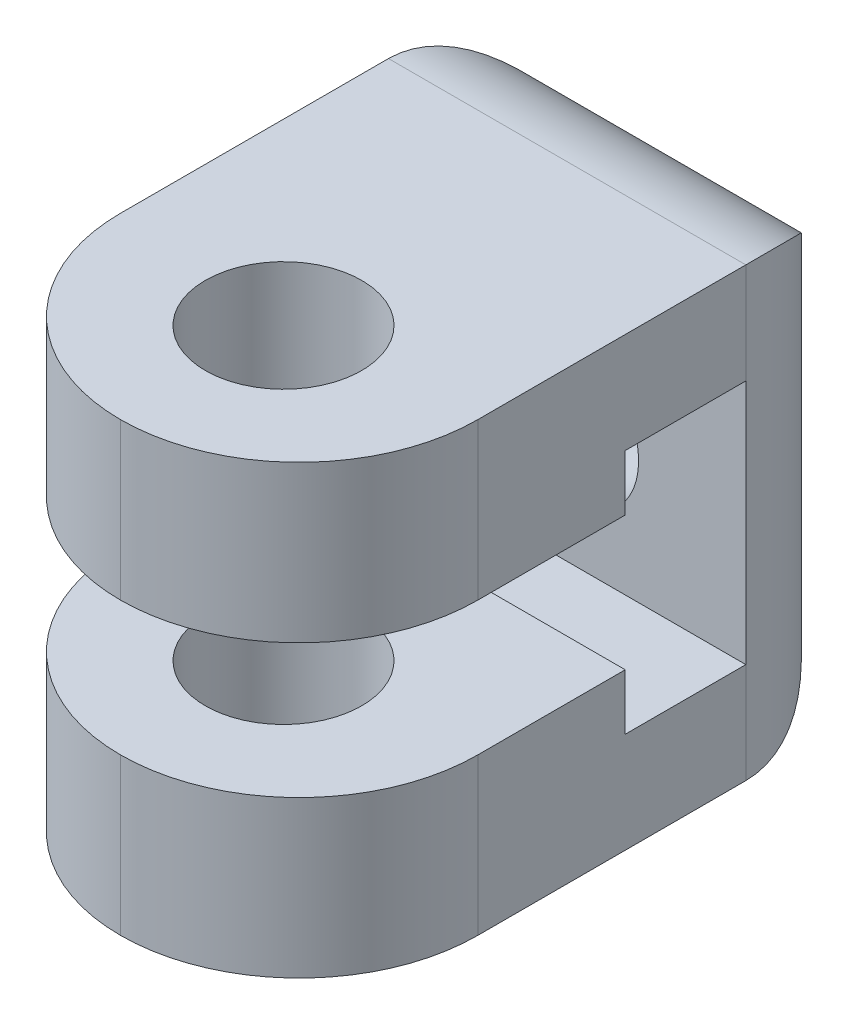
ISO-10303-21;
HEADER;
FILE_DESCRIPTION(('STEP AP214'),'2;1');
FILE_NAME('part.step','',(''),(''),'','','');
FILE_SCHEMA(('AUTOMOTIVE_DESIGN { 1 0 10303 214 1 1 1 1 }'));
ENDSEC;
DATA;
#1=APPLICATION_CONTEXT('core data for automotive mechanical design processes');
#2=APPLICATION_PROTOCOL_DEFINITION('international standard','automotive_design',2000,#1);
#3=PRODUCT_CONTEXT('',#1,'mechanical');
#4=PRODUCT('Part','Part','',(#3));
#5=PRODUCT_RELATED_PRODUCT_CATEGORY('part','',(#4));
#6=PRODUCT_DEFINITION_FORMATION('','',#4);
#7=PRODUCT_DEFINITION_CONTEXT('part definition',#1,'design');
#8=PRODUCT_DEFINITION('design','',#6,#7);
#9=PRODUCT_DEFINITION_SHAPE('','',#8);
#10=(LENGTH_UNIT() NAMED_UNIT(*) SI_UNIT(.MILLI.,.METRE.));
#11=(NAMED_UNIT(*) PLANE_ANGLE_UNIT() SI_UNIT($,.RADIAN.));
#12=(NAMED_UNIT(*) SI_UNIT($,.STERADIAN.) SOLID_ANGLE_UNIT());
#13=UNCERTAINTY_MEASURE_WITH_UNIT(LENGTH_MEASURE(1.E-05),#10,'distance_accuracy_value','');
#14=(GEOMETRIC_REPRESENTATION_CONTEXT(3) GLOBAL_UNCERTAINTY_ASSIGNED_CONTEXT((#13)) GLOBAL_UNIT_ASSIGNED_CONTEXT((#10,
#11,#12)) REPRESENTATION_CONTEXT('',''));
#15=CARTESIAN_POINT('',(0.,0.,0.));
#16=DIRECTION('',(0.,0.,1.));
#17=DIRECTION('',(1.,0.,0.));
#18=AXIS2_PLACEMENT_3D('',#15,#16,#17);
#19=CARTESIAN_POINT('',(4.,-5.,3.));
#20=DIRECTION('',(-1.,0.,0.));
#21=DIRECTION('',(0.,0.,1.));
#22=AXIS2_PLACEMENT_3D('',#19,#20,#21);
#23=PLANE('',#22);
#24=DIRECTION('',(0.,0.,-1.));
#25=VECTOR('',#24,1.);
#26=CARTESIAN_POINT('',(4.,-5.,3.));
#27=LINE('',#26,#25);
#28=CARTESIAN_POINT('',(4.,-5.,9.));
#29=VERTEX_POINT('',#28);
#30=CARTESIAN_POINT('',(4.,-5.,3.));
#31=VERTEX_POINT('',#30);
#32=EDGE_CURVE('E236',#29,#31,#27,.T.);
#33=ORIENTED_EDGE('',*,*,#32,.T.);
#34=DIRECTION('',(0.,1.,0.));
#35=VECTOR('',#34,1.);
#36=CARTESIAN_POINT('',(4.,-5.,3.));
#37=LINE('',#36,#35);
#38=CARTESIAN_POINT('',(4.,-2.75,3.));
#39=VERTEX_POINT('',#38);
#40=EDGE_CURVE('E401',#31,#39,#37,.T.);
#41=ORIENTED_EDGE('',*,*,#40,.T.);
#42=DIRECTION('',(0.,0.,-1.));
#43=VECTOR('',#42,1.);
#44=CARTESIAN_POINT('',(4.,-2.75,3.));
#45=LINE('',#44,#43);
#46=CARTESIAN_POINT('',(4.,-2.75,5.7));
#47=VERTEX_POINT('',#46);
#48=EDGE_CURVE('E201',#47,#39,#45,.T.);
#49=ORIENTED_EDGE('',*,*,#48,.F.);
#50=DIRECTION('',(0.,-1.,0.));
#51=VECTOR('',#50,1.);
#52=CARTESIAN_POINT('',(4.,2.75,5.7));
#53=LINE('',#52,#51);
#54=CARTESIAN_POINT('',(4.,-1.5,5.7));
#55=VERTEX_POINT('',#54);
#56=EDGE_CURVE('E199',#55,#47,#53,.T.);
#57=ORIENTED_EDGE('',*,*,#56,.F.);
#58=DIRECTION('',(0.,0.,-1.));
#59=VECTOR('',#58,1.);
#60=CARTESIAN_POINT('',(4.,-1.5,13.));
#61=LINE('',#60,#59);
#62=CARTESIAN_POINT('',(4.,-1.5,9.));
#63=VERTEX_POINT('',#62);
#64=EDGE_CURVE('E174',#63,#55,#61,.T.);
#65=ORIENTED_EDGE('',*,*,#64,.F.);
#66=DIRECTION('',(0.,1.,0.));
#67=VECTOR('',#66,1.);
#68=CARTESIAN_POINT('',(4.,-5.,9.));
#69=LINE('',#68,#67);
#70=EDGE_CURVE('E267',#63,#29,#69,.F.);
#71=ORIENTED_EDGE('',*,*,#70,.T.);
#72=EDGE_LOOP('',(#33,#41,#49,#57,#65,#71));
#73=FACE_BOUND('',#72,.T.);
#74=ADVANCED_FACE('F33',(#73),#23,.F.);
#75=CARTESIAN_POINT('',(0.,0.,0.));
#76=DIRECTION('',(0.,0.,1.));
#77=DIRECTION('',(1.,0.,0.));
#78=AXIS2_PLACEMENT_3D('',#75,#76,#77);
#79=PLANE('',#78);
#80=DIRECTION('',(1.,0.,0.));
#81=VECTOR('',#80,1.);
#82=CARTESIAN_POINT('',(0.,-2.,0.));
#83=LINE('',#82,#81);
#84=CARTESIAN_POINT('',(0.999999999999999,-2.,0.));
#85=VERTEX_POINT('',#84);
#86=CARTESIAN_POINT('',(-1.,-2.,0.));
#87=VERTEX_POINT('',#86);
#88=EDGE_CURVE('E287',#85,#87,#83,.F.);
#89=ORIENTED_EDGE('',*,*,#88,.T.);
#90=DIRECTION('',(0.,-1.,0.));
#91=VECTOR('',#90,1.);
#92=CARTESIAN_POINT('',(-1.,0.,0.));
#93=LINE('',#92,#91);
#94=CARTESIAN_POINT('',(-1.,-1.24899959967968,0.));
#95=VERTEX_POINT('',#94);
#96=EDGE_CURVE('E291',#87,#95,#93,.F.);
#97=ORIENTED_EDGE('',*,*,#96,.T.);
#98=CARTESIAN_POINT('',(0.,0.,0.));
#99=DIRECTION('',(0.,0.,-1.));
#100=DIRECTION('',(-1.,0.,0.));
#101=AXIS2_PLACEMENT_3D('',#98,#99,#100);
#102=CIRCLE('',#101,1.6);
#103=CARTESIAN_POINT('',(0.999999999999999,-1.24899959967968,0.));
#104=VERTEX_POINT('',#103);
#105=EDGE_CURVE('E425',#104,#95,#102,.T.);
#106=ORIENTED_EDGE('',*,*,#105,.F.);
#107=DIRECTION('',(0.,1.,0.));
#108=VECTOR('',#107,1.);
#109=CARTESIAN_POINT('',(0.999999999999999,0.,0.));
#110=LINE('',#109,#108);
#111=EDGE_CURVE('E289',#104,#85,#110,.F.);
#112=ORIENTED_EDGE('',*,*,#111,.T.);
#113=EDGE_LOOP('',(#89,#97,#106,#112));
#114=FACE_BOUND('',#113,.T.);
#115=ADVANCED_FACE('F348',(#114),#79,.F.);
#116=CARTESIAN_POINT('',(-4.,-5.,3.));
#117=DIRECTION('',(1.,0.,0.));
#118=DIRECTION('',(0.,0.,-1.));
#119=AXIS2_PLACEMENT_3D('',#116,#117,#118);
#120=PLANE('',#119);
#121=DIRECTION('',(0.,0.,-1.));
#122=VECTOR('',#121,1.);
#123=CARTESIAN_POINT('',(-4.,5.,3.));
#124=LINE('',#123,#122);
#125=CARTESIAN_POINT('',(-4.,5.,9.));
#126=VERTEX_POINT('',#125);
#127=CARTESIAN_POINT('',(-4.,5.,3.));
#128=VERTEX_POINT('',#127);
#129=EDGE_CURVE('E231',#126,#128,#124,.T.);
#130=ORIENTED_EDGE('',*,*,#129,.T.);
#131=DIRECTION('',(0.,-1.,0.));
#132=VECTOR('',#131,1.);
#133=CARTESIAN_POINT('',(-4.,-5.,3.));
#134=LINE('',#133,#132);
#135=CARTESIAN_POINT('',(-4.,2.75,3.));
#136=VERTEX_POINT('',#135);
#137=EDGE_CURVE('E278',#128,#136,#134,.T.);
#138=ORIENTED_EDGE('',*,*,#137,.T.);
#139=DIRECTION('',(0.,0.,-1.));
#140=VECTOR('',#139,1.);
#141=CARTESIAN_POINT('',(-4.,2.75,3.));
#142=LINE('',#141,#140);
#143=CARTESIAN_POINT('',(-4.,2.75,5.7));
#144=VERTEX_POINT('',#143);
#145=EDGE_CURVE('E207',#144,#136,#142,.T.);
#146=ORIENTED_EDGE('',*,*,#145,.F.);
#147=DIRECTION('',(0.,1.,0.));
#148=VECTOR('',#147,1.);
#149=CARTESIAN_POINT('',(-4.,2.75,5.7));
#150=LINE('',#149,#148);
#151=CARTESIAN_POINT('',(-4.,1.5,5.7));
#152=VERTEX_POINT('',#151);
#153=EDGE_CURVE('E192',#152,#144,#150,.T.);
#154=ORIENTED_EDGE('',*,*,#153,.F.);
#155=DIRECTION('',(0.,0.,-1.));
#156=VECTOR('',#155,1.);
#157=CARTESIAN_POINT('',(-4.,1.5,13.));
#158=LINE('',#157,#156);
#159=CARTESIAN_POINT('',(-4.,1.5,9.));
#160=VERTEX_POINT('',#159);
#161=EDGE_CURVE('E225',#160,#152,#158,.T.);
#162=ORIENTED_EDGE('',*,*,#161,.F.);
#163=DIRECTION('',(0.,-1.,0.));
#164=VECTOR('',#163,1.);
#165=CARTESIAN_POINT('',(-4.,5.,9.));
#166=LINE('',#165,#164);
#167=EDGE_CURVE('E249',#160,#126,#166,.F.);
#168=ORIENTED_EDGE('',*,*,#167,.T.);
#169=EDGE_LOOP('',(#130,#138,#146,#154,#162,#168));
#170=FACE_BOUND('',#169,.T.);
#171=ADVANCED_FACE('F342',(#170),#120,.F.);
#172=CARTESIAN_POINT('',(0.,0.,3.));
#173=DIRECTION('',(0.,0.,1.));
#174=DIRECTION('',(1.,0.,0.));
#175=AXIS2_PLACEMENT_3D('',#172,#173,#174);
#176=PLANE('',#175);
#177=CARTESIAN_POINT('',(0.,0.,3.));
#178=DIRECTION('',(0.,0.,1.));
#179=DIRECTION('',(1.,0.,0.));
#180=AXIS2_PLACEMENT_3D('',#177,#178,#179);
#181=CIRCLE('',#180,1.6);
#182=CARTESIAN_POINT('',(1.6,0.,3.));
#183=VERTEX_POINT('',#182);
#184=EDGE_CURVE('E434',#183,#183,#181,.F.);
#185=ORIENTED_EDGE('',*,*,#184,.T.);
#186=EDGE_LOOP('',(#185));
#187=FACE_BOUND('',#186,.T.);
#188=DIRECTION('',(0.,-1.,0.));
#189=VECTOR('',#188,1.);
#190=CARTESIAN_POINT('',(-4.,-5.,3.));
#191=LINE('',#190,#189);
#192=CARTESIAN_POINT('',(-4.,-2.75,3.));
#193=VERTEX_POINT('',#192);
#194=EDGE_CURVE('E227',#136,#193,#191,.T.);
#195=ORIENTED_EDGE('',*,*,#194,.T.);
#196=DIRECTION('',(1.,0.,0.));
#197=VECTOR('',#196,1.);
#198=CARTESIAN_POINT('',(-4.001,-2.75,3.));
#199=LINE('',#198,#197);
#200=EDGE_CURVE('E175',#193,#39,#199,.T.);
#201=ORIENTED_EDGE('',*,*,#200,.T.);
#202=DIRECTION('',(0.,1.,0.));
#203=VECTOR('',#202,1.);
#204=CARTESIAN_POINT('',(4.,-5.,3.));
#205=LINE('',#204,#203);
#206=CARTESIAN_POINT('',(4.,2.75,3.));
#207=VERTEX_POINT('',#206);
#208=EDGE_CURVE('E229',#39,#207,#205,.T.);
#209=ORIENTED_EDGE('',*,*,#208,.T.);
#210=DIRECTION('',(1.,0.,0.));
#211=VECTOR('',#210,1.);
#212=CARTESIAN_POINT('',(-4.001,2.75,3.));
#213=LINE('',#212,#211);
#214=EDGE_CURVE('E211',#136,#207,#213,.T.);
#215=ORIENTED_EDGE('',*,*,#214,.F.);
#216=EDGE_LOOP('',(#195,#201,#209,#215));
#217=FACE_BOUND('',#216,.T.);
#218=ADVANCED_FACE('F339',(#187,#217),#176,.T.);
#219=DIRECTION('',(0.,0.,1.));
#220=VECTOR('',#219,1.);
#221=CARTESIAN_POINT('',(-4.,-2.75,3.));
#222=LINE('',#221,#220);
#223=CARTESIAN_POINT('',(-4.,-2.75,5.7));
#224=VERTEX_POINT('',#223);
#225=EDGE_CURVE('E185',#193,#224,#222,.T.);
#226=ORIENTED_EDGE('',*,*,#225,.F.);
#227=DIRECTION('',(0.,-1.,0.));
#228=VECTOR('',#227,1.);
#229=CARTESIAN_POINT('',(-4.,-5.,3.));
#230=LINE('',#229,#228);
#231=CARTESIAN_POINT('',(-4.,-5.,3.));
#232=VERTEX_POINT('',#231);
#233=EDGE_CURVE('E269',#193,#232,#230,.T.);
#234=ORIENTED_EDGE('',*,*,#233,.T.);
#235=DIRECTION('',(0.,0.,-1.));
#236=VECTOR('',#235,1.);
#237=CARTESIAN_POINT('',(-4.,-5.,3.));
#238=LINE('',#237,#236);
#239=CARTESIAN_POINT('',(-4.,-5.,9.));
#240=VERTEX_POINT('',#239);
#241=EDGE_CURVE('E238',#240,#232,#238,.T.);
#242=ORIENTED_EDGE('',*,*,#241,.F.);
#243=DIRECTION('',(0.,-1.,0.));
#244=VECTOR('',#243,1.);
#245=CARTESIAN_POINT('',(-4.,-1.5,9.));
#246=LINE('',#245,#244);
#247=CARTESIAN_POINT('',(-4.,-1.5,9.));
#248=VERTEX_POINT('',#247);
#249=EDGE_CURVE('E171',#240,#248,#246,.F.);
#250=ORIENTED_EDGE('',*,*,#249,.T.);
#251=DIRECTION('',(0.,0.,-1.));
#252=VECTOR('',#251,1.);
#253=CARTESIAN_POINT('',(-4.,-1.5,13.));
#254=LINE('',#253,#252);
#255=CARTESIAN_POINT('',(-4.,-1.5,5.7));
#256=VERTEX_POINT('',#255);
#257=EDGE_CURVE('E164',#248,#256,#254,.T.);
#258=ORIENTED_EDGE('',*,*,#257,.T.);
#259=DIRECTION('',(0.,1.,0.));
#260=VECTOR('',#259,1.);
#261=CARTESIAN_POINT('',(-4.,2.75,5.7));
#262=LINE('',#261,#260);
#263=EDGE_CURVE('E168',#224,#256,#262,.T.);
#264=ORIENTED_EDGE('',*,*,#263,.F.);
#265=EDGE_LOOP('',(#226,#234,#242,#250,#258,#264));
#266=FACE_BOUND('',#265,.T.);
#267=ADVANCED_FACE('F167',(#266),#120,.F.);
#268=CARTESIAN_POINT('',(4.,-5.,3.));
#269=DIRECTION('',(0.,1.,0.));
#270=DIRECTION('',(-1.,0.,0.));
#271=AXIS2_PLACEMENT_3D('',#268,#269,#270);
#272=PLANE('',#271);
#273=CARTESIAN_POINT('',(0.,-5.,9.35));
#274=DIRECTION('',(0.,1.,0.));
#275=DIRECTION('',(-1.,0.,0.));
#276=AXIS2_PLACEMENT_3D('',#273,#274,#275);
#277=CIRCLE('',#276,1.75);
#278=CARTESIAN_POINT('',(-1.75,-5.,9.35));
#279=VERTEX_POINT('',#278);
#280=EDGE_CURVE('E245',#279,#279,#277,.T.);
#281=ORIENTED_EDGE('',*,*,#280,.T.);
#282=EDGE_LOOP('',(#281));
#283=FACE_BOUND('',#282,.T.);
#284=ORIENTED_EDGE('',*,*,#241,.T.);
#285=DIRECTION('',(1.,0.,0.));
#286=VECTOR('',#285,1.);
#287=CARTESIAN_POINT('',(4.,-5.,3.));
#288=LINE('',#287,#286);
#289=EDGE_CURVE('E43',#232,#31,#288,.T.);
#290=ORIENTED_EDGE('',*,*,#289,.T.);
#291=ORIENTED_EDGE('',*,*,#32,.F.);
#292=CARTESIAN_POINT('',(0.,-5.,9.));
#293=DIRECTION('',(0.,1.,0.));
#294=DIRECTION('',(-1.,0.,0.));
#295=AXIS2_PLACEMENT_3D('',#292,#293,#294);
#296=CIRCLE('',#295,4.);
#297=CARTESIAN_POINT('',(0.,-5.,13.));
#298=VERTEX_POINT('',#297);
#299=EDGE_CURVE('E240',#29,#298,#296,.F.);
#300=ORIENTED_EDGE('',*,*,#299,.T.);
#301=CARTESIAN_POINT('',(0.,-5.,9.));
#302=DIRECTION('',(0.,1.,0.));
#303=DIRECTION('',(-1.,0.,0.));
#304=AXIS2_PLACEMENT_3D('',#301,#302,#303);
#305=CIRCLE('',#304,4.);
#306=EDGE_CURVE('E247',#298,#240,#305,.F.);
#307=ORIENTED_EDGE('',*,*,#306,.T.);
#308=EDGE_LOOP('',(#284,#290,#291,#300,#307));
#309=FACE_BOUND('',#308,.T.);
#310=ADVANCED_FACE('F355',(#283,#309),#272,.F.);
#311=DIRECTION('',(0.,0.,1.));
#312=VECTOR('',#311,1.);
#313=CARTESIAN_POINT('',(4.,2.75,3.));
#314=LINE('',#313,#312);
#315=CARTESIAN_POINT('',(4.,2.75,5.7));
#316=VERTEX_POINT('',#315);
#317=EDGE_CURVE('E210',#207,#316,#314,.T.);
#318=ORIENTED_EDGE('',*,*,#317,.F.);
#319=DIRECTION('',(0.,1.,0.));
#320=VECTOR('',#319,1.);
#321=CARTESIAN_POINT('',(4.,-5.,3.));
#322=LINE('',#321,#320);
#323=CARTESIAN_POINT('',(4.,5.,3.));
#324=VERTEX_POINT('',#323);
#325=EDGE_CURVE('E51',#207,#324,#322,.T.);
#326=ORIENTED_EDGE('',*,*,#325,.T.);
#327=DIRECTION('',(0.,0.,-1.));
#328=VECTOR('',#327,1.);
#329=CARTESIAN_POINT('',(4.,5.,3.));
#330=LINE('',#329,#328);
#331=CARTESIAN_POINT('',(4.,5.,9.));
#332=VERTEX_POINT('',#331);
#333=EDGE_CURVE('E234',#332,#324,#330,.T.);
#334=ORIENTED_EDGE('',*,*,#333,.F.);
#335=DIRECTION('',(0.,1.,0.));
#336=VECTOR('',#335,1.);
#337=CARTESIAN_POINT('',(4.,1.5,9.));
#338=LINE('',#337,#336);
#339=CARTESIAN_POINT('',(4.,1.5,9.));
#340=VERTEX_POINT('',#339);
#341=EDGE_CURVE('E265',#332,#340,#338,.F.);
#342=ORIENTED_EDGE('',*,*,#341,.T.);
#343=DIRECTION('',(0.,0.,-1.));
#344=VECTOR('',#343,1.);
#345=CARTESIAN_POINT('',(4.,1.5,13.));
#346=LINE('',#345,#344);
#347=CARTESIAN_POINT('',(4.,1.5,5.7));
#348=VERTEX_POINT('',#347);
#349=EDGE_CURVE('E223',#340,#348,#346,.T.);
#350=ORIENTED_EDGE('',*,*,#349,.T.);
#351=DIRECTION('',(0.,-1.,0.));
#352=VECTOR('',#351,1.);
#353=CARTESIAN_POINT('',(4.,2.75,5.7));
#354=LINE('',#353,#352);
#355=EDGE_CURVE('E216',#316,#348,#354,.T.);
#356=ORIENTED_EDGE('',*,*,#355,.F.);
#357=EDGE_LOOP('',(#318,#326,#334,#342,#350,#356));
#358=FACE_BOUND('',#357,.T.);
#359=ADVANCED_FACE('F351',(#358),#23,.F.);
#360=CARTESIAN_POINT('',(4.,5.,3.));
#361=DIRECTION('',(0.,-1.,0.));
#362=DIRECTION('',(1.,0.,0.));
#363=AXIS2_PLACEMENT_3D('',#360,#361,#362);
#364=PLANE('',#363);
#365=CARTESIAN_POINT('',(0.,5.,9.35));
#366=DIRECTION('',(0.,1.,0.));
#367=DIRECTION('',(-1.,0.,0.));
#368=AXIS2_PLACEMENT_3D('',#365,#366,#367);
#369=CIRCLE('',#368,1.75);
#370=CARTESIAN_POINT('',(-1.75,5.,9.35));
#371=VERTEX_POINT('',#370);
#372=EDGE_CURVE('E273',#371,#371,#369,.T.);
#373=ORIENTED_EDGE('',*,*,#372,.F.);
#374=EDGE_LOOP('',(#373));
#375=FACE_BOUND('',#374,.T.);
#376=ORIENTED_EDGE('',*,*,#333,.T.);
#377=DIRECTION('',(-1.,0.,0.));
#378=VECTOR('',#377,1.);
#379=CARTESIAN_POINT('',(4.,5.,3.));
#380=LINE('',#379,#378);
#381=EDGE_CURVE('E11',#324,#128,#380,.T.);
#382=ORIENTED_EDGE('',*,*,#381,.T.);
#383=ORIENTED_EDGE('',*,*,#129,.F.);
#384=CARTESIAN_POINT('',(0.,5.,9.));
#385=DIRECTION('',(0.,-1.,0.));
#386=DIRECTION('',(1.,0.,0.));
#387=AXIS2_PLACEMENT_3D('',#384,#385,#386);
#388=CIRCLE('',#387,4.);
#389=CARTESIAN_POINT('',(0.,5.,13.));
#390=VERTEX_POINT('',#389);
#391=EDGE_CURVE('E263',#126,#390,#388,.F.);
#392=ORIENTED_EDGE('',*,*,#391,.T.);
#393=CARTESIAN_POINT('',(0.,5.,9.));
#394=DIRECTION('',(0.,-1.,0.));
#395=DIRECTION('',(1.,0.,0.));
#396=AXIS2_PLACEMENT_3D('',#393,#394,#395);
#397=CIRCLE('',#396,4.);
#398=EDGE_CURVE('E261',#390,#332,#397,.F.);
#399=ORIENTED_EDGE('',*,*,#398,.T.);
#400=EDGE_LOOP('',(#376,#382,#383,#392,#399));
#401=FACE_BOUND('',#400,.T.);
#402=ADVANCED_FACE('F346',(#375,#401),#364,.F.);
#403=CARTESIAN_POINT('',(-1.,1.24899959967968,0.));
#404=VERTEX_POINT('',#403);
#405=CARTESIAN_POINT('',(0.999999999999999,1.24899959967968,0.));
#406=VERTEX_POINT('',#405);
#407=EDGE_CURVE('E195',#404,#406,#102,.T.);
#408=ORIENTED_EDGE('',*,*,#407,.F.);
#409=DIRECTION('',(0.,-1.,0.));
#410=VECTOR('',#409,1.);
#411=CARTESIAN_POINT('',(-1.,0.,0.));
#412=LINE('',#411,#410);
#413=CARTESIAN_POINT('',(-1.,2.,0.));
#414=VERTEX_POINT('',#413);
#415=EDGE_CURVE('E285',#404,#414,#412,.F.);
#416=ORIENTED_EDGE('',*,*,#415,.T.);
#417=DIRECTION('',(-1.,0.,0.));
#418=VECTOR('',#417,1.);
#419=CARTESIAN_POINT('',(0.,2.,0.));
#420=LINE('',#419,#418);
#421=CARTESIAN_POINT('',(0.999999999999999,2.,0.));
#422=VERTEX_POINT('',#421);
#423=EDGE_CURVE('E281',#414,#422,#420,.F.);
#424=ORIENTED_EDGE('',*,*,#423,.T.);
#425=DIRECTION('',(0.,1.,0.));
#426=VECTOR('',#425,1.);
#427=CARTESIAN_POINT('',(0.999999999999999,0.,0.));
#428=LINE('',#427,#426);
#429=EDGE_CURVE('E283',#422,#406,#428,.F.);
#430=ORIENTED_EDGE('',*,*,#429,.T.);
#431=EDGE_LOOP('',(#408,#416,#424,#430));
#432=FACE_BOUND('',#431,.T.);
#433=ADVANCED_FACE('F337',(#432),#79,.F.);
#434=CARTESIAN_POINT('',(-4.,1.5,13.));
#435=DIRECTION('',(0.,1.,0.));
#436=DIRECTION('',(-1.,0.,0.));
#437=AXIS2_PLACEMENT_3D('',#434,#435,#436);
#438=PLANE('',#437);
#439=CARTESIAN_POINT('',(0.,1.5,9.35));
#440=DIRECTION('',(0.,1.,0.));
#441=DIRECTION('',(-1.,0.,0.));
#442=AXIS2_PLACEMENT_3D('',#439,#440,#441);
#443=CIRCLE('',#442,1.75);
#444=CARTESIAN_POINT('',(-1.75,1.5,9.35));
#445=VERTEX_POINT('',#444);
#446=EDGE_CURVE('E244',#445,#445,#443,.T.);
#447=ORIENTED_EDGE('',*,*,#446,.T.);
#448=EDGE_LOOP('',(#447));
#449=FACE_BOUND('',#448,.T.);
#450=CARTESIAN_POINT('',(0.,1.5,9.));
#451=DIRECTION('',(0.,1.,0.));
#452=DIRECTION('',(-1.,0.,0.));
#453=AXIS2_PLACEMENT_3D('',#450,#451,#452);
#454=CIRCLE('',#453,4.);
#455=CARTESIAN_POINT('',(0.,1.5,13.));
#456=VERTEX_POINT('',#455);
#457=EDGE_CURVE('E257',#340,#456,#454,.F.);
#458=ORIENTED_EDGE('',*,*,#457,.T.);
#459=CARTESIAN_POINT('',(0.,1.5,9.));
#460=DIRECTION('',(0.,1.,0.));
#461=DIRECTION('',(-1.,0.,0.));
#462=AXIS2_PLACEMENT_3D('',#459,#460,#461);
#463=CIRCLE('',#462,4.);
#464=EDGE_CURVE('E259',#456,#160,#463,.F.);
#465=ORIENTED_EDGE('',*,*,#464,.T.);
#466=ORIENTED_EDGE('',*,*,#161,.T.);
#467=DIRECTION('',(-1.,0.,0.));
#468=VECTOR('',#467,1.);
#469=CARTESIAN_POINT('',(-4.001,1.5,5.7));
#470=LINE('',#469,#468);
#471=EDGE_CURVE('E189',#348,#152,#470,.T.);
#472=ORIENTED_EDGE('',*,*,#471,.F.);
#473=ORIENTED_EDGE('',*,*,#349,.F.);
#474=EDGE_LOOP('',(#458,#465,#466,#472,#473));
#475=FACE_BOUND('',#474,.T.);
#476=ADVANCED_FACE('F333',(#449,#475),#438,.F.);
#477=CARTESIAN_POINT('',(4.,-1.5,13.));
#478=DIRECTION('',(0.,-1.,0.));
#479=DIRECTION('',(0.,0.,-1.));
#480=AXIS2_PLACEMENT_3D('',#477,#478,#479);
#481=PLANE('',#480);
#482=CARTESIAN_POINT('',(0.,-1.5,9.35));
#483=DIRECTION('',(0.,-1.,0.));
#484=DIRECTION('',(0.,0.,-1.));
#485=AXIS2_PLACEMENT_3D('',#482,#483,#484);
#486=CIRCLE('',#485,1.75);
#487=CARTESIAN_POINT('',(0.,-1.5,7.6));
#488=VERTEX_POINT('',#487);
#489=EDGE_CURVE('E241',#488,#488,#486,.T.);
#490=ORIENTED_EDGE('',*,*,#489,.T.);
#491=EDGE_LOOP('',(#490));
#492=FACE_BOUND('',#491,.T.);
#493=ORIENTED_EDGE('',*,*,#257,.F.);
#494=CARTESIAN_POINT('',(0.,-1.5,9.));
#495=DIRECTION('',(0.,-1.,0.));
#496=DIRECTION('',(0.,0.,-1.));
#497=AXIS2_PLACEMENT_3D('',#494,#495,#496);
#498=CIRCLE('',#497,4.);
#499=CARTESIAN_POINT('',(0.,-1.5,13.));
#500=VERTEX_POINT('',#499);
#501=EDGE_CURVE('E255',#248,#500,#498,.F.);
#502=ORIENTED_EDGE('',*,*,#501,.T.);
#503=CARTESIAN_POINT('',(0.,-1.5,9.));
#504=DIRECTION('',(0.,-1.,0.));
#505=DIRECTION('',(0.,0.,-1.));
#506=AXIS2_PLACEMENT_3D('',#503,#504,#505);
#507=CIRCLE('',#506,4.);
#508=EDGE_CURVE('E253',#500,#63,#507,.F.);
#509=ORIENTED_EDGE('',*,*,#508,.T.);
#510=ORIENTED_EDGE('',*,*,#64,.T.);
#511=DIRECTION('',(1.,0.,0.));
#512=VECTOR('',#511,1.);
#513=CARTESIAN_POINT('',(-4.001,-1.5,5.7));
#514=LINE('',#513,#512);
#515=EDGE_CURVE('E182',#256,#55,#514,.T.);
#516=ORIENTED_EDGE('',*,*,#515,.F.);
#517=EDGE_LOOP('',(#493,#502,#509,#510,#516));
#518=FACE_BOUND('',#517,.T.);
#519=ADVANCED_FACE('F187',(#492,#518),#481,.F.);
#520=CARTESIAN_POINT('',(-4.001,2.75,5.7));
#521=DIRECTION('',(0.,0.,1.));
#522=DIRECTION('',(0.,-1.,0.));
#523=AXIS2_PLACEMENT_3D('',#520,#521,#522);
#524=PLANE('',#523);
#525=ORIENTED_EDGE('',*,*,#263,.T.);
#526=ORIENTED_EDGE('',*,*,#515,.T.);
#527=ORIENTED_EDGE('',*,*,#56,.T.);
#528=DIRECTION('',(1.,0.,0.));
#529=VECTOR('',#528,1.);
#530=CARTESIAN_POINT('',(-4.001,-2.75,5.7));
#531=LINE('',#530,#529);
#532=EDGE_CURVE('E184',#224,#47,#531,.T.);
#533=ORIENTED_EDGE('',*,*,#532,.F.);
#534=EDGE_LOOP('',(#525,#526,#527,#533));
#535=FACE_BOUND('',#534,.T.);
#536=ADVANCED_FACE('F180',(#535),#524,.F.);
#537=CARTESIAN_POINT('',(-4.001,-2.75,3.));
#538=DIRECTION('',(0.,-1.,0.));
#539=DIRECTION('',(0.,0.,-1.));
#540=AXIS2_PLACEMENT_3D('',#537,#538,#539);
#541=PLANE('',#540);
#542=ORIENTED_EDGE('',*,*,#225,.T.);
#543=ORIENTED_EDGE('',*,*,#532,.T.);
#544=ORIENTED_EDGE('',*,*,#48,.T.);
#545=ORIENTED_EDGE('',*,*,#200,.F.);
#546=EDGE_LOOP('',(#542,#543,#544,#545));
#547=FACE_BOUND('',#546,.T.);
#548=ADVANCED_FACE('F317',(#547),#541,.F.);
#549=CARTESIAN_POINT('',(-4.001,2.75,5.7));
#550=DIRECTION('',(0.,0.,1.));
#551=DIRECTION('',(0.,-1.,0.));
#552=AXIS2_PLACEMENT_3D('',#549,#550,#551);
#553=PLANE('',#552);
#554=ORIENTED_EDGE('',*,*,#153,.T.);
#555=DIRECTION('',(1.,0.,0.));
#556=VECTOR('',#555,1.);
#557=CARTESIAN_POINT('',(-4.001,2.75,5.7));
#558=LINE('',#557,#556);
#559=EDGE_CURVE('E214',#144,#316,#558,.T.);
#560=ORIENTED_EDGE('',*,*,#559,.T.);
#561=ORIENTED_EDGE('',*,*,#355,.T.);
#562=ORIENTED_EDGE('',*,*,#471,.T.);
#563=EDGE_LOOP('',(#554,#560,#561,#562));
#564=FACE_BOUND('',#563,.T.);
#565=ADVANCED_FACE('F321',(#564),#553,.F.);
#566=CARTESIAN_POINT('',(-4.001,2.75,3.));
#567=DIRECTION('',(0.,1.,0.));
#568=DIRECTION('',(0.,0.,1.));
#569=AXIS2_PLACEMENT_3D('',#566,#567,#568);
#570=PLANE('',#569);
#571=ORIENTED_EDGE('',*,*,#145,.T.);
#572=ORIENTED_EDGE('',*,*,#214,.T.);
#573=ORIENTED_EDGE('',*,*,#317,.T.);
#574=ORIENTED_EDGE('',*,*,#559,.F.);
#575=EDGE_LOOP('',(#571,#572,#573,#574));
#576=FACE_BOUND('',#575,.T.);
#577=ADVANCED_FACE('F314',(#576),#570,.F.);
#578=CARTESIAN_POINT('',(0.,0.,13.001));
#579=DIRECTION('',(0.,0.,-1.));
#580=DIRECTION('',(-1.,0.,0.));
#581=AXIS2_PLACEMENT_3D('',#578,#579,#580);
#582=CYLINDRICAL_SURFACE('',#581,1.6);
#583=ORIENTED_EDGE('',*,*,#184,.F.);
#584=EDGE_LOOP('',(#583));
#585=FACE_BOUND('',#584,.T.);
#586=ORIENTED_EDGE('',*,*,#105,.T.);
#587=CARTESIAN_POINT('',(-1.,-1.24899959967968,0.));
#588=CARTESIAN_POINT('',(-1.03491914825695,-1.22104267949954,-8.03123037614443E-07));
#589=CARTESIAN_POINT('',(-1.06864299296124,-1.19163690583393,0.00060971860139488));
#590=CARTESIAN_POINT('',(-1.13348742846532,-1.13013431599604,0.00279597334940566));
#591=CARTESIAN_POINT('',(-1.16460884628587,-1.09803836127392,0.00437139840302123));
#592=CARTESIAN_POINT('',(-1.25367823371579,-0.998114391654543,0.010153020246962));
#593=CARTESIAN_POINT('',(-1.30745584061709,-0.926550310944104,0.0154163781097013));
#594=CARTESIAN_POINT('',(-1.40228516692703,-0.775596469695074,0.0267091945816712));
#595=CARTESIAN_POINT('',(-1.44334249223873,-0.696210176840736,0.0327383140587636));
#596=CARTESIAN_POINT('',(-1.51171372100079,-0.531650881497939,0.0437603878714151));
#597=CARTESIAN_POINT('',(-1.53902957738723,-0.446478703252893,0.0487534893864398));
#598=CARTESIAN_POINT('',(-1.57930392318541,-0.27185051377551,0.0563902481514071));
#599=CARTESIAN_POINT('',(-1.59212571254524,-0.182361881883961,0.0590114899803308));
#600=CARTESIAN_POINT('',(-1.6025320518774,-0.00246714329845963,0.0611251760962768));
#601=CARTESIAN_POINT('',(-1.60011774724234,0.0879388939182576,0.0606178555769896));
#602=CARTESIAN_POINT('',(-1.58033342591623,0.265237079605648,0.0566501891414192));
#603=CARTESIAN_POINT('',(-1.5632551308432,0.352163372395472,0.0532474556242872));
#604=CARTESIAN_POINT('',(-1.51504108833887,0.521960410801144,0.0444413650526435));
#605=CARTESIAN_POINT('',(-1.48389822055839,0.604829078615385,0.0390369948965254));
#606=CARTESIAN_POINT('',(-1.40797260296514,0.765238240334,0.0276193805598297));
#607=CARTESIAN_POINT('',(-1.36302885454223,0.842701836904637,0.0215995411326577));
#608=CARTESIAN_POINT('',(-1.26084285067176,0.989045239484727,0.0109232568295089));
#609=CARTESIAN_POINT('',(-1.20362170540201,1.05793946273122,0.00626450372564926));
#610=CARTESIAN_POINT('',(-1.11886244933844,1.14418472784425,0.00227275944640486));
#611=CARTESIAN_POINT('',(-1.0959528417852,1.16614592423201,0.00144232532991326));
#612=CARTESIAN_POINT('',(-1.04889418393453,1.20864485491359,0.000306317308691858));
#613=CARTESIAN_POINT('',(-1.02474687125666,1.22918449455495,2.72750556092343E-08));
#614=CARTESIAN_POINT('',(-1.,1.24899959967968,0.));
#615=B_SPLINE_CURVE_WITH_KNOTS('',3,(#587,#588,#589,#590,#591,#592,#593,#594,#595,#596,#597,
#598,#599,#600,#601,#602,#603,#604,#605,#606,#607,#608,#609,#610,#611,#612,#613,#614),
.UNSPECIFIED.,.F.,.F.,(4,2,2,2,2,2,2,2,2,2,2,2,2,4),(0.,0.134100940169929,0.268159101385698,
0.535802687400047,0.803328152971779,1.07081558710414,1.34080529977501,1.6107747158701,
1.87549466763389,2.14034878736598,2.40841824157297,2.67603040978813,2.77122310737162,
2.8662856406856),.UNSPECIFIED.);
#616=EDGE_CURVE('E301',#95,#404,#615,.T.);
#617=ORIENTED_EDGE('',*,*,#616,.T.);
#618=ORIENTED_EDGE('',*,*,#407,.T.);
#619=CARTESIAN_POINT('',(0.999999999999999,1.24899959967968,0.));
#620=CARTESIAN_POINT('',(1.03491914825694,1.22104267949954,-8.03123037599555E-07));
#621=CARTESIAN_POINT('',(1.06864299296123,1.19163690583393,0.000609718601394906));
#622=CARTESIAN_POINT('',(1.13348742846532,1.13013431599604,0.0027959733494057));
#623=CARTESIAN_POINT('',(1.16460884628586,1.09803836127392,0.00437139840302127));
#624=CARTESIAN_POINT('',(1.25367823371579,0.998114391654545,0.010153020246962));
#625=CARTESIAN_POINT('',(1.30745584061709,0.926550310944106,0.0154163781097013));
#626=CARTESIAN_POINT('',(1.40228516692702,0.775596469695077,0.0267091945816712));
#627=CARTESIAN_POINT('',(1.44334249223873,0.696210176840739,0.0327383140587636));
#628=CARTESIAN_POINT('',(1.51171372100078,0.531650881497942,0.0437603878714152));
#629=CARTESIAN_POINT('',(1.53902957738723,0.446478703252896,0.0487534893864399));
#630=CARTESIAN_POINT('',(1.57930392318541,0.271850513775513,0.0563902481514072));
#631=CARTESIAN_POINT('',(1.59212571254524,0.182361881883964,0.0590114899803308));
#632=CARTESIAN_POINT('',(1.6025320518774,0.00246714329846252,0.0611251760962771));
#633=CARTESIAN_POINT('',(1.60011774724234,-0.0879388939182546,0.0606178555769902));
#634=CARTESIAN_POINT('',(1.58033342591623,-0.265237079605645,0.05665018914142));
#635=CARTESIAN_POINT('',(1.5632551308432,-0.352163372395469,0.0532474556242879));
#636=CARTESIAN_POINT('',(1.51504108833887,-0.521960410801141,0.044441365052644));
#637=CARTESIAN_POINT('',(1.4838982205584,-0.604829078615381,0.0390369948965259));
#638=CARTESIAN_POINT('',(1.40797260296515,-0.765238240333997,0.02761938055983));
#639=CARTESIAN_POINT('',(1.36302885454223,-0.842701836904634,0.0215995411326576));
#640=CARTESIAN_POINT('',(1.26084285067177,-0.989045239484724,0.0109232568295088));
#641=CARTESIAN_POINT('',(1.20362170540201,-1.05793946273121,0.0062645037256495));
#642=CARTESIAN_POINT('',(1.11886244933844,-1.14418472784425,0.00227275944640501));
#643=CARTESIAN_POINT('',(1.0959528417852,-1.16614592423201,0.00144232532991333));
#644=CARTESIAN_POINT('',(1.04889418393453,-1.20864485491359,0.000306317308691778));
#645=CARTESIAN_POINT('',(1.02474687125666,-1.22918449455495,2.72750554630968E-08));
#646=CARTESIAN_POINT('',(0.999999999999999,-1.24899959967968,0.));
#647=B_SPLINE_CURVE_WITH_KNOTS('',3,(#619,#620,#621,#622,#623,#624,#625,#626,#627,#628,#629,
#630,#631,#632,#633,#634,#635,#636,#637,#638,#639,#640,#641,#642,#643,#644,#645,#646),
.UNSPECIFIED.,.F.,.F.,(4,2,2,2,2,2,2,2,2,2,2,2,2,4),(0.,0.134100940169929,0.268159101385698,
0.535802687400046,0.803328152971778,1.07081558710414,1.34080529977501,1.61077471587009,
1.87549466763389,2.14034878736598,2.40841824157297,2.67603040978812,2.77122310737162,
2.8662856406856),.UNSPECIFIED.);
#648=EDGE_CURVE('E294',#406,#104,#647,.T.);
#649=ORIENTED_EDGE('',*,*,#648,.T.);
#650=EDGE_LOOP('',(#586,#617,#618,#649));
#651=FACE_BOUND('',#650,.T.);
#652=ADVANCED_FACE('F308',(#585,#651),#582,.F.);
#653=CARTESIAN_POINT('',(0.,-5.,9.35));
#654=DIRECTION('',(0.,1.,0.));
#655=DIRECTION('',(-1.,0.,0.));
#656=AXIS2_PLACEMENT_3D('',#653,#654,#655);
#657=CYLINDRICAL_SURFACE('',#656,1.75);
#658=ORIENTED_EDGE('',*,*,#280,.F.);
#659=EDGE_LOOP('',(#658));
#660=FACE_BOUND('',#659,.T.);
#661=ORIENTED_EDGE('',*,*,#489,.F.);
#662=EDGE_LOOP('',(#661));
#663=FACE_BOUND('',#662,.T.);
#664=ADVANCED_FACE('F313',(#660,#663),#657,.F.);
#665=ORIENTED_EDGE('',*,*,#372,.T.);
#666=EDGE_LOOP('',(#665));
#667=FACE_BOUND('',#666,.T.);
#668=ORIENTED_EDGE('',*,*,#446,.F.);
#669=EDGE_LOOP('',(#668));
#670=FACE_BOUND('',#669,.T.);
#671=ADVANCED_FACE('F316',(#667,#670),#657,.F.);
#672=CARTESIAN_POINT('',(0.,0.,9.));
#673=DIRECTION('',(0.,-1.,0.));
#674=DIRECTION('',(0.,0.,-1.));
#675=AXIS2_PLACEMENT_3D('',#672,#673,#674);
#676=CYLINDRICAL_SURFACE('',#675,4.);
#677=ORIENTED_EDGE('',*,*,#70,.F.);
#678=ORIENTED_EDGE('',*,*,#508,.F.);
#679=DIRECTION('',(0.,1.,0.));
#680=VECTOR('',#679,1.);
#681=CARTESIAN_POINT('',(0.,-1.5,13.));
#682=LINE('',#681,#680);
#683=EDGE_CURVE('E270',#298,#500,#682,.T.);
#684=ORIENTED_EDGE('',*,*,#683,.F.);
#685=ORIENTED_EDGE('',*,*,#299,.F.);
#686=EDGE_LOOP('',(#677,#678,#684,#685));
#687=FACE_BOUND('',#686,.T.);
#688=ADVANCED_FACE('F365',(#687),#676,.T.);
#689=CARTESIAN_POINT('',(0.,0.,9.));
#690=DIRECTION('',(0.,1.,0.));
#691=DIRECTION('',(0.,0.,1.));
#692=AXIS2_PLACEMENT_3D('',#689,#690,#691);
#693=CYLINDRICAL_SURFACE('',#692,4.);
#694=ORIENTED_EDGE('',*,*,#501,.F.);
#695=ORIENTED_EDGE('',*,*,#249,.F.);
#696=ORIENTED_EDGE('',*,*,#306,.F.);
#697=ORIENTED_EDGE('',*,*,#683,.T.);
#698=EDGE_LOOP('',(#694,#695,#696,#697));
#699=FACE_BOUND('',#698,.T.);
#700=ADVANCED_FACE('F361',(#699),#693,.T.);
#701=CARTESIAN_POINT('',(0.,0.,9.));
#702=DIRECTION('',(0.,-1.,0.));
#703=DIRECTION('',(0.,0.,-1.));
#704=AXIS2_PLACEMENT_3D('',#701,#702,#703);
#705=CYLINDRICAL_SURFACE('',#704,4.);
#706=ORIENTED_EDGE('',*,*,#341,.F.);
#707=ORIENTED_EDGE('',*,*,#398,.F.);
#708=DIRECTION('',(0.,1.,0.));
#709=VECTOR('',#708,1.);
#710=CARTESIAN_POINT('',(0.,5.,13.));
#711=LINE('',#710,#709);
#712=EDGE_CURVE('E274',#456,#390,#711,.T.);
#713=ORIENTED_EDGE('',*,*,#712,.F.);
#714=ORIENTED_EDGE('',*,*,#457,.F.);
#715=EDGE_LOOP('',(#706,#707,#713,#714));
#716=FACE_BOUND('',#715,.T.);
#717=ADVANCED_FACE('F364',(#716),#705,.T.);
#718=CARTESIAN_POINT('',(0.,0.,9.));
#719=DIRECTION('',(0.,1.,0.));
#720=DIRECTION('',(0.,0.,1.));
#721=AXIS2_PLACEMENT_3D('',#718,#719,#720);
#722=CYLINDRICAL_SURFACE('',#721,4.);
#723=ORIENTED_EDGE('',*,*,#391,.F.);
#724=ORIENTED_EDGE('',*,*,#167,.F.);
#725=ORIENTED_EDGE('',*,*,#464,.F.);
#726=ORIENTED_EDGE('',*,*,#712,.T.);
#727=EDGE_LOOP('',(#723,#724,#725,#726));
#728=FACE_BOUND('',#727,.T.);
#729=ADVANCED_FACE('F370',(#728),#722,.T.);
#730=CARTESIAN_POINT('',(0.999999999999999,-5.,3.));
#731=DIRECTION('',(0.,1.,0.));
#732=DIRECTION('',(0.,0.,1.));
#733=AXIS2_PLACEMENT_3D('',#730,#731,#732);
#734=CYLINDRICAL_SURFACE('',#733,3.);
#735=ORIENTED_EDGE('',*,*,#648,.F.);
#736=ORIENTED_EDGE('',*,*,#429,.F.);
#737=CARTESIAN_POINT('',(0.999999999999999,2.,3.));
#738=DIRECTION('',(-0.707106781186548,0.707106781186547,0.));
#739=DIRECTION('',(-0.707106781186547,-0.707106781186547,0.));
#740=AXIS2_PLACEMENT_3D('',#737,#738,#739);
#741=ELLIPSE('',#740,4.24264068711929,3.);
#742=EDGE_CURVE('E38',#324,#422,#741,.T.);
#743=ORIENTED_EDGE('',*,*,#742,.F.);
#744=ORIENTED_EDGE('',*,*,#325,.F.);
#745=ORIENTED_EDGE('',*,*,#208,.F.);
#746=ORIENTED_EDGE('',*,*,#40,.F.);
#747=CARTESIAN_POINT('',(0.999999999999999,-2.,3.));
#748=DIRECTION('',(0.707106781186547,0.707106781186548,0.));
#749=DIRECTION('',(0.707106781186548,-0.707106781186547,0.));
#750=AXIS2_PLACEMENT_3D('',#747,#748,#749);
#751=ELLIPSE('',#750,4.24264068711928,3.);
#752=EDGE_CURVE('E409',#85,#31,#751,.F.);
#753=ORIENTED_EDGE('',*,*,#752,.F.);
#754=ORIENTED_EDGE('',*,*,#111,.F.);
#755=EDGE_LOOP('',(#735,#736,#743,#744,#745,#746,#753,#754));
#756=FACE_BOUND('',#755,.T.);
#757=ADVANCED_FACE('F35',(#756),#734,.T.);
#758=CARTESIAN_POINT('',(4.,2.,3.));
#759=DIRECTION('',(-1.,0.,0.));
#760=DIRECTION('',(0.,-1.,0.));
#761=AXIS2_PLACEMENT_3D('',#758,#759,#760);
#762=CYLINDRICAL_SURFACE('',#761,3.);
#763=ORIENTED_EDGE('',*,*,#742,.T.);
#764=ORIENTED_EDGE('',*,*,#423,.F.);
#765=CARTESIAN_POINT('',(-1.,2.,3.));
#766=DIRECTION('',(-0.707106781186547,-0.707106781186547,0.));
#767=DIRECTION('',(-0.707106781186548,0.707106781186547,0.));
#768=AXIS2_PLACEMENT_3D('',#765,#766,#767);
#769=ELLIPSE('',#768,4.24264068711928,3.);
#770=EDGE_CURVE('E414',#128,#414,#769,.T.);
#771=ORIENTED_EDGE('',*,*,#770,.F.);
#772=ORIENTED_EDGE('',*,*,#381,.F.);
#773=EDGE_LOOP('',(#763,#764,#771,#772));
#774=FACE_BOUND('',#773,.T.);
#775=ADVANCED_FACE('F383',(#774),#762,.T.);
#776=CARTESIAN_POINT('',(4.,-2.,3.));
#777=DIRECTION('',(1.,0.,0.));
#778=DIRECTION('',(0.,1.,0.));
#779=AXIS2_PLACEMENT_3D('',#776,#777,#778);
#780=CYLINDRICAL_SURFACE('',#779,3.);
#781=ORIENTED_EDGE('',*,*,#752,.T.);
#782=ORIENTED_EDGE('',*,*,#289,.F.);
#783=CARTESIAN_POINT('',(-1.,-2.,3.));
#784=DIRECTION('',(0.707106781186548,-0.707106781186547,0.));
#785=DIRECTION('',(0.707106781186547,0.707106781186548,0.));
#786=AXIS2_PLACEMENT_3D('',#783,#784,#785);
#787=ELLIPSE('',#786,4.24264068711929,3.);
#788=EDGE_CURVE('E416',#87,#232,#787,.F.);
#789=ORIENTED_EDGE('',*,*,#788,.F.);
#790=ORIENTED_EDGE('',*,*,#88,.F.);
#791=EDGE_LOOP('',(#781,#782,#789,#790));
#792=FACE_BOUND('',#791,.T.);
#793=ADVANCED_FACE('F380',(#792),#780,.T.);
#794=CARTESIAN_POINT('',(-1.,-5.,3.));
#795=DIRECTION('',(0.,-1.,0.));
#796=DIRECTION('',(0.,0.,-1.));
#797=AXIS2_PLACEMENT_3D('',#794,#795,#796);
#798=CYLINDRICAL_SURFACE('',#797,3.);
#799=ORIENTED_EDGE('',*,*,#616,.F.);
#800=ORIENTED_EDGE('',*,*,#96,.F.);
#801=ORIENTED_EDGE('',*,*,#788,.T.);
#802=ORIENTED_EDGE('',*,*,#233,.F.);
#803=ORIENTED_EDGE('',*,*,#194,.F.);
#804=ORIENTED_EDGE('',*,*,#137,.F.);
#805=ORIENTED_EDGE('',*,*,#770,.T.);
#806=ORIENTED_EDGE('',*,*,#415,.F.);
#807=EDGE_LOOP('',(#799,#800,#801,#802,#803,#804,#805,#806));
#808=FACE_BOUND('',#807,.T.);
#809=ADVANCED_FACE('F376',(#808),#798,.T.);
#810=CLOSED_SHELL('',(#74,#115,#171,#218,#267,#310,#359,#402,#433,#476,#519,#536,#548,#565,#577,
#652,#664,#671,#688,#700,#717,#729,#757,#775,#793,#809));
#811=MANIFOLD_SOLID_BREP('B2',#810);
#812=ADVANCED_BREP_SHAPE_REPRESENTATION('',(#18,#811),#14);
#813=SHAPE_DEFINITION_REPRESENTATION(#9,#812);
ENDSEC;
END-ISO-10303-21;
